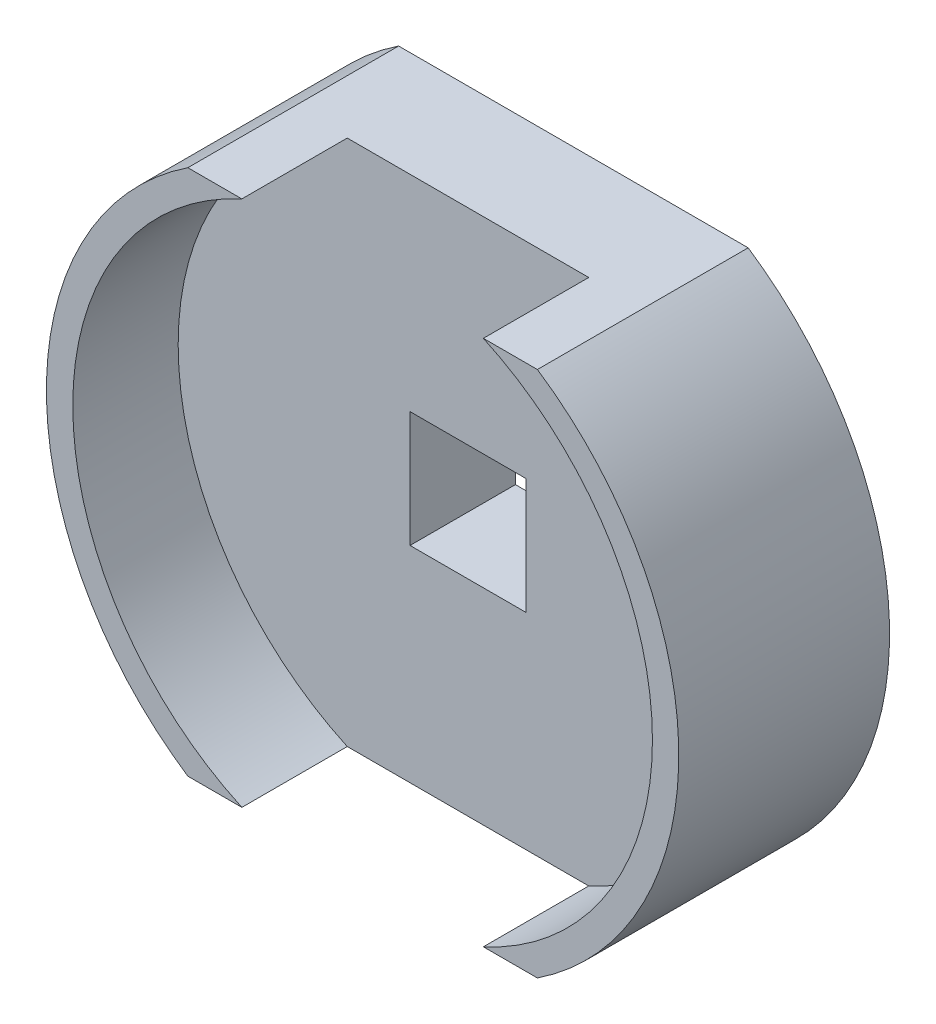
ISO-10303-21;
HEADER;
FILE_DESCRIPTION(('STEP AP214'),'2;1');
FILE_NAME('part.step','',(''),(''),'','','');
FILE_SCHEMA(('AUTOMOTIVE_DESIGN { 1 0 10303 214 1 1 1 1 }'));
ENDSEC;
DATA;
#1=APPLICATION_CONTEXT('core data for automotive mechanical design processes');
#2=APPLICATION_PROTOCOL_DEFINITION('international standard','automotive_design',2000,#1);
#3=PRODUCT_CONTEXT('',#1,'mechanical');
#4=PRODUCT('Part','Part','',(#3));
#5=PRODUCT_RELATED_PRODUCT_CATEGORY('part','',(#4));
#6=PRODUCT_DEFINITION_FORMATION('','',#4);
#7=PRODUCT_DEFINITION_CONTEXT('part definition',#1,'design');
#8=PRODUCT_DEFINITION('design','',#6,#7);
#9=PRODUCT_DEFINITION_SHAPE('','',#8);
#10=(LENGTH_UNIT() NAMED_UNIT(*) SI_UNIT(.MILLI.,.METRE.));
#11=(NAMED_UNIT(*) PLANE_ANGLE_UNIT() SI_UNIT($,.RADIAN.));
#12=(NAMED_UNIT(*) SI_UNIT($,.STERADIAN.) SOLID_ANGLE_UNIT());
#13=UNCERTAINTY_MEASURE_WITH_UNIT(LENGTH_MEASURE(1.E-05),#10,'distance_accuracy_value','');
#14=(GEOMETRIC_REPRESENTATION_CONTEXT(3) GLOBAL_UNCERTAINTY_ASSIGNED_CONTEXT((#13)) GLOBAL_UNIT_ASSIGNED_CONTEXT((#10,
#11,#12)) REPRESENTATION_CONTEXT('',''));
#15=CARTESIAN_POINT('',(0.,0.,0.));
#16=DIRECTION('',(0.,0.,1.));
#17=DIRECTION('',(1.,0.,0.));
#18=AXIS2_PLACEMENT_3D('',#15,#16,#17);
#19=CARTESIAN_POINT('',(0.,0.,0.));
#20=DIRECTION('',(0.,0.,1.));
#21=DIRECTION('',(1.,0.,0.));
#22=AXIS2_PLACEMENT_3D('',#19,#20,#21);
#23=PLANE('',#22);
#24=CARTESIAN_POINT('',(0.,0.,0.));
#25=DIRECTION('',(0.,0.,1.));
#26=DIRECTION('',(1.,0.,0.));
#27=AXIS2_PLACEMENT_3D('',#24,#25,#26);
#28=CIRCLE('',#27,6.);
#29=CARTESIAN_POINT('',(-3.3166247903554,5.,0.));
#30=VERTEX_POINT('',#29);
#31=CARTESIAN_POINT('',(-3.3166247903554,-5.,0.));
#32=VERTEX_POINT('',#31);
#33=EDGE_CURVE('E238',#30,#32,#28,.T.);
#34=ORIENTED_EDGE('',*,*,#33,.F.);
#35=DIRECTION('',(-1.,0.,0.));
#36=VECTOR('',#35,1.);
#37=CARTESIAN_POINT('',(-10.,5.,0.));
#38=LINE('',#37,#36);
#39=CARTESIAN_POINT('',(3.3166247903554,5.,0.));
#40=VERTEX_POINT('',#39);
#41=EDGE_CURVE('E152',#40,#30,#38,.T.);
#42=ORIENTED_EDGE('',*,*,#41,.F.);
#43=CARTESIAN_POINT('',(3.3166247903554,-5.,0.));
#44=VERTEX_POINT('',#43);
#45=EDGE_CURVE('E234',#44,#40,#28,.T.);
#46=ORIENTED_EDGE('',*,*,#45,.F.);
#47=DIRECTION('',(1.,0.,0.));
#48=VECTOR('',#47,1.);
#49=CARTESIAN_POINT('',(-10.,-5.,0.));
#50=LINE('',#49,#48);
#51=EDGE_CURVE('E185',#32,#44,#50,.T.);
#52=ORIENTED_EDGE('',*,*,#51,.F.);
#53=EDGE_LOOP('',(#34,#42,#46,#52));
#54=FACE_BOUND('',#53,.T.);
#55=DIRECTION('',(0.,1.,0.));
#56=VECTOR('',#55,1.);
#57=CARTESIAN_POINT('',(1.1,1.1,0.));
#58=LINE('',#57,#56);
#59=CARTESIAN_POINT('',(1.1,-1.1,0.));
#60=VERTEX_POINT('',#59);
#61=CARTESIAN_POINT('',(1.1,1.1,0.));
#62=VERTEX_POINT('',#61);
#63=EDGE_CURVE('E61',#60,#62,#58,.T.);
#64=ORIENTED_EDGE('',*,*,#63,.T.);
#65=DIRECTION('',(-1.,0.,0.));
#66=VECTOR('',#65,1.);
#67=CARTESIAN_POINT('',(-1.1,1.1,0.));
#68=LINE('',#67,#66);
#69=CARTESIAN_POINT('',(-1.1,1.1,0.));
#70=VERTEX_POINT('',#69);
#71=EDGE_CURVE('E150',#62,#70,#68,.T.);
#72=ORIENTED_EDGE('',*,*,#71,.T.);
#73=DIRECTION('',(0.,-1.,0.));
#74=VECTOR('',#73,1.);
#75=CARTESIAN_POINT('',(-1.1,1.1,0.));
#76=LINE('',#75,#74);
#77=CARTESIAN_POINT('',(-1.1,-1.1,0.));
#78=VERTEX_POINT('',#77);
#79=EDGE_CURVE('E170',#70,#78,#76,.T.);
#80=ORIENTED_EDGE('',*,*,#79,.T.);
#81=DIRECTION('',(1.,0.,0.));
#82=VECTOR('',#81,1.);
#83=CARTESIAN_POINT('',(-1.1,-1.1,0.));
#84=LINE('',#83,#82);
#85=EDGE_CURVE('E144',#78,#60,#84,.T.);
#86=ORIENTED_EDGE('',*,*,#85,.T.);
#87=EDGE_LOOP('',(#64,#72,#80,#86));
#88=FACE_BOUND('',#87,.T.);
#89=ADVANCED_FACE('F45',(#54,#88),#23,.F.);
#90=CARTESIAN_POINT('',(0.,0.,2.));
#91=DIRECTION('',(0.,0.,1.));
#92=DIRECTION('',(1.,0.,0.));
#93=AXIS2_PLACEMENT_3D('',#90,#91,#92);
#94=PLANE('',#93);
#95=DIRECTION('',(1.,0.,0.));
#96=VECTOR('',#95,1.);
#97=CARTESIAN_POINT('',(0.,5.,2.));
#98=LINE('',#97,#96);
#99=CARTESIAN_POINT('',(-2.29128784747792,5.,2.));
#100=VERTEX_POINT('',#99);
#101=CARTESIAN_POINT('',(2.29128784747792,5.,2.));
#102=VERTEX_POINT('',#101);
#103=EDGE_CURVE('E11',#100,#102,#98,.T.);
#104=ORIENTED_EDGE('',*,*,#103,.F.);
#105=CARTESIAN_POINT('',(0.,0.,2.));
#106=DIRECTION('',(0.,0.,1.));
#107=DIRECTION('',(1.,0.,0.));
#108=AXIS2_PLACEMENT_3D('',#105,#106,#107);
#109=CIRCLE('',#108,5.5);
#110=CARTESIAN_POINT('',(-2.29128784747792,-5.,2.));
#111=VERTEX_POINT('',#110);
#112=EDGE_CURVE('E242',#111,#100,#109,.F.);
#113=ORIENTED_EDGE('',*,*,#112,.F.);
#114=DIRECTION('',(-1.,0.,0.));
#115=VECTOR('',#114,1.);
#116=CARTESIAN_POINT('',(0.,-5.,2.));
#117=LINE('',#116,#115);
#118=CARTESIAN_POINT('',(2.29128784747792,-5.,2.));
#119=VERTEX_POINT('',#118);
#120=EDGE_CURVE('E54',#119,#111,#117,.T.);
#121=ORIENTED_EDGE('',*,*,#120,.F.);
#122=EDGE_CURVE('E239',#102,#119,#109,.F.);
#123=ORIENTED_EDGE('',*,*,#122,.F.);
#124=EDGE_LOOP('',(#104,#113,#121,#123));
#125=FACE_BOUND('',#124,.T.);
#126=DIRECTION('',(-1.,0.,0.));
#127=VECTOR('',#126,1.);
#128=CARTESIAN_POINT('',(-1.1,1.1,2.));
#129=LINE('',#128,#127);
#130=CARTESIAN_POINT('',(1.1,1.1,2.));
#131=VERTEX_POINT('',#130);
#132=CARTESIAN_POINT('',(-1.1,1.1,2.));
#133=VERTEX_POINT('',#132);
#134=EDGE_CURVE('E143',#131,#133,#129,.T.);
#135=ORIENTED_EDGE('',*,*,#134,.F.);
#136=DIRECTION('',(0.,1.,0.));
#137=VECTOR('',#136,1.);
#138=CARTESIAN_POINT('',(1.1,1.1,2.));
#139=LINE('',#138,#137);
#140=CARTESIAN_POINT('',(1.1,-1.1,2.));
#141=VERTEX_POINT('',#140);
#142=EDGE_CURVE('E134',#141,#131,#139,.T.);
#143=ORIENTED_EDGE('',*,*,#142,.F.);
#144=DIRECTION('',(1.,0.,0.));
#145=VECTOR('',#144,1.);
#146=CARTESIAN_POINT('',(-1.1,-1.1,2.));
#147=LINE('',#146,#145);
#148=CARTESIAN_POINT('',(-1.1,-1.1,2.));
#149=VERTEX_POINT('',#148);
#150=EDGE_CURVE('E161',#149,#141,#147,.T.);
#151=ORIENTED_EDGE('',*,*,#150,.F.);
#152=DIRECTION('',(0.,-1.,0.));
#153=VECTOR('',#152,1.);
#154=CARTESIAN_POINT('',(-1.1,1.1,2.));
#155=LINE('',#154,#153);
#156=EDGE_CURVE('E157',#133,#149,#155,.T.);
#157=ORIENTED_EDGE('',*,*,#156,.F.);
#158=EDGE_LOOP('',(#135,#143,#151,#157));
#159=FACE_BOUND('',#158,.T.);
#160=ADVANCED_FACE('F156',(#125,#159),#94,.T.);
#161=CARTESIAN_POINT('',(0.,0.,2.));
#162=DIRECTION('',(0.,0.,-1.));
#163=DIRECTION('',(-1.,0.,0.));
#164=AXIS2_PLACEMENT_3D('',#161,#162,#163);
#165=CYLINDRICAL_SURFACE('',#164,6.);
#166=CARTESIAN_POINT('',(0.,0.,4.));
#167=DIRECTION('',(0.,0.,1.));
#168=DIRECTION('',(1.,0.,0.));
#169=AXIS2_PLACEMENT_3D('',#166,#167,#168);
#170=CIRCLE('',#169,6.);
#171=CARTESIAN_POINT('',(-3.3166247903554,5.,4.));
#172=VERTEX_POINT('',#171);
#173=CARTESIAN_POINT('',(-3.3166247903554,-5.,4.));
#174=VERTEX_POINT('',#173);
#175=EDGE_CURVE('E233',#172,#174,#170,.T.);
#176=ORIENTED_EDGE('',*,*,#175,.F.);
#177=DIRECTION('',(0.,0.,-1.));
#178=VECTOR('',#177,1.);
#179=CARTESIAN_POINT('',(-3.3166247903554,5.,2.));
#180=LINE('',#179,#178);
#181=EDGE_CURVE('E220',#172,#30,#180,.T.);
#182=ORIENTED_EDGE('',*,*,#181,.T.);
#183=ORIENTED_EDGE('',*,*,#33,.T.);
#184=DIRECTION('',(0.,0.,-1.));
#185=VECTOR('',#184,1.);
#186=CARTESIAN_POINT('',(-3.3166247903554,-5.,2.));
#187=LINE('',#186,#185);
#188=EDGE_CURVE('E198',#32,#174,#187,.F.);
#189=ORIENTED_EDGE('',*,*,#188,.T.);
#190=EDGE_LOOP('',(#176,#182,#183,#189));
#191=FACE_BOUND('',#190,.T.);
#192=ADVANCED_FACE('F281',(#191),#165,.T.);
#193=CARTESIAN_POINT('',(0.,0.,4.));
#194=DIRECTION('',(0.,0.,1.));
#195=DIRECTION('',(1.,0.,0.));
#196=AXIS2_PLACEMENT_3D('',#193,#194,#195);
#197=PLANE('',#196);
#198=DIRECTION('',(1.,0.,0.));
#199=VECTOR('',#198,1.);
#200=CARTESIAN_POINT('',(0.,5.,4.));
#201=LINE('',#200,#199);
#202=CARTESIAN_POINT('',(-2.29128784747792,5.,4.));
#203=VERTEX_POINT('',#202);
#204=EDGE_CURVE('E215',#172,#203,#201,.T.);
#205=ORIENTED_EDGE('',*,*,#204,.F.);
#206=ORIENTED_EDGE('',*,*,#175,.T.);
#207=DIRECTION('',(-1.,0.,0.));
#208=VECTOR('',#207,1.);
#209=CARTESIAN_POINT('',(0.,-5.,4.));
#210=LINE('',#209,#208);
#211=CARTESIAN_POINT('',(-2.29128784747792,-5.,4.));
#212=VERTEX_POINT('',#211);
#213=EDGE_CURVE('E194',#212,#174,#210,.T.);
#214=ORIENTED_EDGE('',*,*,#213,.F.);
#215=CARTESIAN_POINT('',(0.,0.,4.));
#216=DIRECTION('',(0.,0.,1.));
#217=DIRECTION('',(1.,0.,0.));
#218=AXIS2_PLACEMENT_3D('',#215,#216,#217);
#219=CIRCLE('',#218,5.5);
#220=EDGE_CURVE('E228',#203,#212,#219,.T.);
#221=ORIENTED_EDGE('',*,*,#220,.F.);
#222=EDGE_LOOP('',(#205,#206,#214,#221));
#223=FACE_BOUND('',#222,.T.);
#224=ADVANCED_FACE('F291',(#223),#197,.T.);
#225=CARTESIAN_POINT('',(0.,0.,4.));
#226=DIRECTION('',(0.,0.,-1.));
#227=DIRECTION('',(-1.,0.,0.));
#228=AXIS2_PLACEMENT_3D('',#225,#226,#227);
#229=CYLINDRICAL_SURFACE('',#228,5.5);
#230=DIRECTION('',(0.,0.,-1.));
#231=VECTOR('',#230,1.);
#232=CARTESIAN_POINT('',(-2.29128784747792,5.,4.));
#233=LINE('',#232,#231);
#234=EDGE_CURVE('E209',#203,#100,#233,.T.);
#235=ORIENTED_EDGE('',*,*,#234,.F.);
#236=ORIENTED_EDGE('',*,*,#220,.T.);
#237=DIRECTION('',(0.,0.,-1.));
#238=VECTOR('',#237,1.);
#239=CARTESIAN_POINT('',(-2.29128784747792,-5.,4.));
#240=LINE('',#239,#238);
#241=EDGE_CURVE('E188',#111,#212,#240,.F.);
#242=ORIENTED_EDGE('',*,*,#241,.F.);
#243=ORIENTED_EDGE('',*,*,#112,.T.);
#244=EDGE_LOOP('',(#235,#236,#242,#243));
#245=FACE_BOUND('',#244,.T.);
#246=ADVANCED_FACE('F252',(#245),#229,.F.);
#247=ORIENTED_EDGE('',*,*,#45,.T.);
#248=DIRECTION('',(0.,0.,-1.));
#249=VECTOR('',#248,1.);
#250=CARTESIAN_POINT('',(3.3166247903554,5.,2.));
#251=LINE('',#250,#249);
#252=CARTESIAN_POINT('',(3.3166247903554,5.,4.));
#253=VERTEX_POINT('',#252);
#254=EDGE_CURVE('E216',#40,#253,#251,.F.);
#255=ORIENTED_EDGE('',*,*,#254,.T.);
#256=CARTESIAN_POINT('',(3.3166247903554,-5.,4.));
#257=VERTEX_POINT('',#256);
#258=EDGE_CURVE('E229',#257,#253,#170,.T.);
#259=ORIENTED_EDGE('',*,*,#258,.F.);
#260=DIRECTION('',(0.,0.,-1.));
#261=VECTOR('',#260,1.);
#262=CARTESIAN_POINT('',(3.3166247903554,-5.,2.));
#263=LINE('',#262,#261);
#264=EDGE_CURVE('E202',#257,#44,#263,.T.);
#265=ORIENTED_EDGE('',*,*,#264,.T.);
#266=EDGE_LOOP('',(#247,#255,#259,#265));
#267=FACE_BOUND('',#266,.T.);
#268=ADVANCED_FACE('F47',(#267),#165,.T.);
#269=CARTESIAN_POINT('',(2.29128784747792,5.,4.));
#270=VERTEX_POINT('',#269);
#271=EDGE_CURVE('E212',#270,#253,#201,.T.);
#272=ORIENTED_EDGE('',*,*,#271,.F.);
#273=CARTESIAN_POINT('',(2.29128784747792,-5.,4.));
#274=VERTEX_POINT('',#273);
#275=EDGE_CURVE('E224',#274,#270,#219,.T.);
#276=ORIENTED_EDGE('',*,*,#275,.F.);
#277=EDGE_CURVE('E197',#257,#274,#210,.T.);
#278=ORIENTED_EDGE('',*,*,#277,.F.);
#279=ORIENTED_EDGE('',*,*,#258,.T.);
#280=EDGE_LOOP('',(#272,#276,#278,#279));
#281=FACE_BOUND('',#280,.T.);
#282=ADVANCED_FACE('F268',(#281),#197,.T.);
#283=DIRECTION('',(0.,0.,-1.));
#284=VECTOR('',#283,1.);
#285=CARTESIAN_POINT('',(2.29128784747792,5.,4.));
#286=LINE('',#285,#284);
#287=EDGE_CURVE('E206',#102,#270,#286,.F.);
#288=ORIENTED_EDGE('',*,*,#287,.F.);
#289=ORIENTED_EDGE('',*,*,#122,.T.);
#290=DIRECTION('',(0.,0.,-1.));
#291=VECTOR('',#290,1.);
#292=CARTESIAN_POINT('',(2.29128784747792,-5.,4.));
#293=LINE('',#292,#291);
#294=EDGE_CURVE('E191',#274,#119,#293,.T.);
#295=ORIENTED_EDGE('',*,*,#294,.F.);
#296=ORIENTED_EDGE('',*,*,#275,.T.);
#297=EDGE_LOOP('',(#288,#289,#295,#296));
#298=FACE_BOUND('',#297,.T.);
#299=ADVANCED_FACE('F263',(#298),#229,.F.);
#300=CARTESIAN_POINT('',(-10.,-5.,6.));
#301=DIRECTION('',(0.,1.,0.));
#302=DIRECTION('',(0.,0.,1.));
#303=AXIS2_PLACEMENT_3D('',#300,#301,#302);
#304=PLANE('',#303);
#305=ORIENTED_EDGE('',*,*,#277,.T.);
#306=ORIENTED_EDGE('',*,*,#294,.T.);
#307=ORIENTED_EDGE('',*,*,#120,.T.);
#308=ORIENTED_EDGE('',*,*,#241,.T.);
#309=ORIENTED_EDGE('',*,*,#213,.T.);
#310=ORIENTED_EDGE('',*,*,#188,.F.);
#311=ORIENTED_EDGE('',*,*,#51,.T.);
#312=ORIENTED_EDGE('',*,*,#264,.F.);
#313=EDGE_LOOP('',(#305,#306,#307,#308,#309,#310,#311,#312));
#314=FACE_BOUND('',#313,.T.);
#315=ADVANCED_FACE('F290',(#314),#304,.F.);
#316=CARTESIAN_POINT('',(-10.,5.,6.));
#317=DIRECTION('',(0.,-1.,0.));
#318=DIRECTION('',(0.,0.,-1.));
#319=AXIS2_PLACEMENT_3D('',#316,#317,#318);
#320=PLANE('',#319);
#321=ORIENTED_EDGE('',*,*,#204,.T.);
#322=ORIENTED_EDGE('',*,*,#234,.T.);
#323=ORIENTED_EDGE('',*,*,#103,.T.);
#324=ORIENTED_EDGE('',*,*,#287,.T.);
#325=ORIENTED_EDGE('',*,*,#271,.T.);
#326=ORIENTED_EDGE('',*,*,#254,.F.);
#327=ORIENTED_EDGE('',*,*,#41,.T.);
#328=ORIENTED_EDGE('',*,*,#181,.F.);
#329=EDGE_LOOP('',(#321,#322,#323,#324,#325,#326,#327,#328));
#330=FACE_BOUND('',#329,.T.);
#331=ADVANCED_FACE('F260',(#330),#320,.F.);
#332=CARTESIAN_POINT('',(1.1,1.1,2.));
#333=DIRECTION('',(-1.,0.,0.));
#334=DIRECTION('',(0.,0.,1.));
#335=AXIS2_PLACEMENT_3D('',#332,#333,#334);
#336=PLANE('',#335);
#337=ORIENTED_EDGE('',*,*,#63,.F.);
#338=DIRECTION('',(0.,0.,-1.));
#339=VECTOR('',#338,1.);
#340=CARTESIAN_POINT('',(1.1,-1.1,2.));
#341=LINE('',#340,#339);
#342=EDGE_CURVE('E138',#141,#60,#341,.T.);
#343=ORIENTED_EDGE('',*,*,#342,.F.);
#344=ORIENTED_EDGE('',*,*,#142,.T.);
#345=DIRECTION('',(0.,0.,-1.));
#346=VECTOR('',#345,1.);
#347=CARTESIAN_POINT('',(1.1,1.1,2.));
#348=LINE('',#347,#346);
#349=EDGE_CURVE('E137',#131,#62,#348,.T.);
#350=ORIENTED_EDGE('',*,*,#349,.T.);
#351=EDGE_LOOP('',(#337,#343,#344,#350));
#352=FACE_BOUND('',#351,.T.);
#353=ADVANCED_FACE('F136',(#352),#336,.T.);
#354=CARTESIAN_POINT('',(-1.1,1.1,2.));
#355=DIRECTION('',(0.,-1.,0.));
#356=DIRECTION('',(0.,0.,-1.));
#357=AXIS2_PLACEMENT_3D('',#354,#355,#356);
#358=PLANE('',#357);
#359=ORIENTED_EDGE('',*,*,#71,.F.);
#360=ORIENTED_EDGE('',*,*,#349,.F.);
#361=ORIENTED_EDGE('',*,*,#134,.T.);
#362=DIRECTION('',(0.,0.,-1.));
#363=VECTOR('',#362,1.);
#364=CARTESIAN_POINT('',(-1.1,1.1,2.));
#365=LINE('',#364,#363);
#366=EDGE_CURVE('E153',#133,#70,#365,.T.);
#367=ORIENTED_EDGE('',*,*,#366,.T.);
#368=EDGE_LOOP('',(#359,#360,#361,#367));
#369=FACE_BOUND('',#368,.T.);
#370=ADVANCED_FACE('F147',(#369),#358,.T.);
#371=CARTESIAN_POINT('',(-1.1,1.1,2.));
#372=DIRECTION('',(1.,0.,0.));
#373=DIRECTION('',(0.,0.,-1.));
#374=AXIS2_PLACEMENT_3D('',#371,#372,#373);
#375=PLANE('',#374);
#376=ORIENTED_EDGE('',*,*,#79,.F.);
#377=ORIENTED_EDGE('',*,*,#366,.F.);
#378=ORIENTED_EDGE('',*,*,#156,.T.);
#379=DIRECTION('',(0.,0.,-1.));
#380=VECTOR('',#379,1.);
#381=CARTESIAN_POINT('',(-1.1,-1.1,2.));
#382=LINE('',#381,#380);
#383=EDGE_CURVE('E69',#149,#78,#382,.T.);
#384=ORIENTED_EDGE('',*,*,#383,.T.);
#385=EDGE_LOOP('',(#376,#377,#378,#384));
#386=FACE_BOUND('',#385,.T.);
#387=ADVANCED_FACE('F324',(#386),#375,.T.);
#388=CARTESIAN_POINT('',(-1.1,-1.1,2.));
#389=DIRECTION('',(0.,1.,0.));
#390=DIRECTION('',(0.,0.,1.));
#391=AXIS2_PLACEMENT_3D('',#388,#389,#390);
#392=PLANE('',#391);
#393=ORIENTED_EDGE('',*,*,#85,.F.);
#394=ORIENTED_EDGE('',*,*,#383,.F.);
#395=ORIENTED_EDGE('',*,*,#150,.T.);
#396=ORIENTED_EDGE('',*,*,#342,.T.);
#397=EDGE_LOOP('',(#393,#394,#395,#396));
#398=FACE_BOUND('',#397,.T.);
#399=ADVANCED_FACE('F332',(#398),#392,.T.);
#400=CLOSED_SHELL('',(#89,#160,#192,#224,#246,#268,#282,#299,#315,#331,#353,#370,#387,#399));
#401=MANIFOLD_SOLID_BREP('B2',#400);
#402=ADVANCED_BREP_SHAPE_REPRESENTATION('',(#18,#401),#14);
#403=SHAPE_DEFINITION_REPRESENTATION(#9,#402);
ENDSEC;
END-ISO-10303-21;
